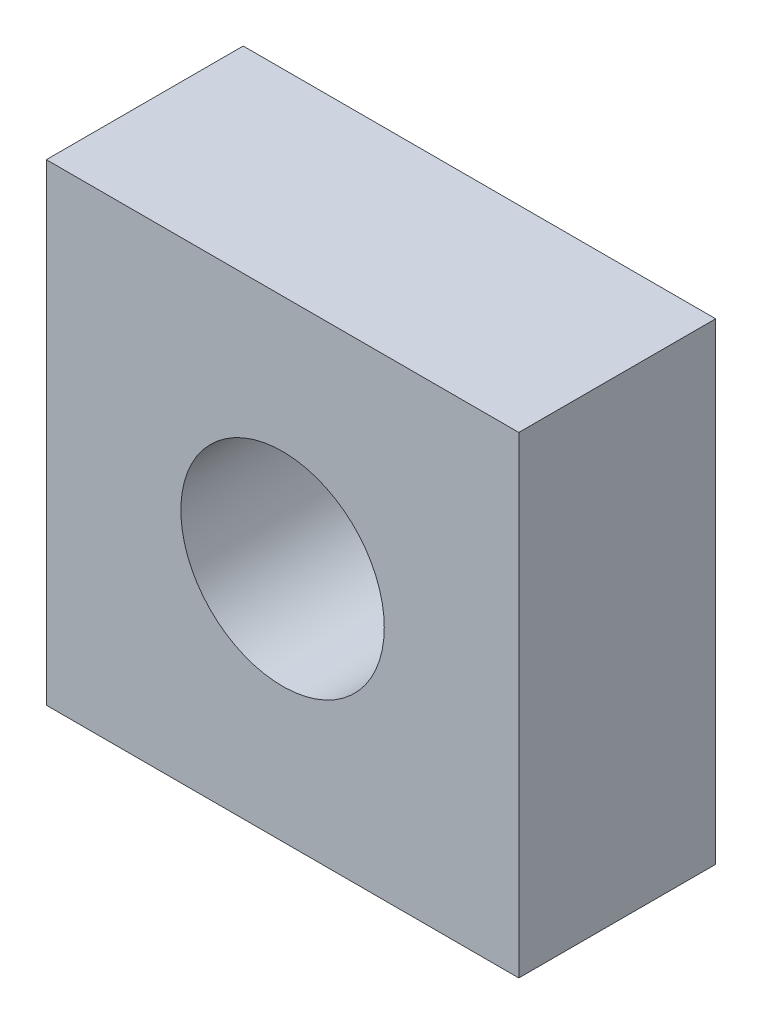
ISO-10303-21;
HEADER;
FILE_DESCRIPTION(('STEP AP214'),'2;1');
FILE_NAME('part.step','',(''),(''),'','','');
FILE_SCHEMA(('AUTOMOTIVE_DESIGN { 1 0 10303 214 1 1 1 1 }'));
ENDSEC;
DATA;
#1=APPLICATION_CONTEXT('core data for automotive mechanical design processes');
#2=APPLICATION_PROTOCOL_DEFINITION('international standard','automotive_design',2000,#1);
#3=PRODUCT_CONTEXT('',#1,'mechanical');
#4=PRODUCT('Part','Part','',(#3));
#5=PRODUCT_RELATED_PRODUCT_CATEGORY('part','',(#4));
#6=PRODUCT_DEFINITION_FORMATION('','',#4);
#7=PRODUCT_DEFINITION_CONTEXT('part definition',#1,'design');
#8=PRODUCT_DEFINITION('design','',#6,#7);
#9=PRODUCT_DEFINITION_SHAPE('','',#8);
#10=(LENGTH_UNIT() NAMED_UNIT(*) SI_UNIT(.MILLI.,.METRE.));
#11=(NAMED_UNIT(*) PLANE_ANGLE_UNIT() SI_UNIT($,.RADIAN.));
#12=(NAMED_UNIT(*) SI_UNIT($,.STERADIAN.) SOLID_ANGLE_UNIT());
#13=UNCERTAINTY_MEASURE_WITH_UNIT(LENGTH_MEASURE(1.E-05),#10,'distance_accuracy_value','');
#14=(GEOMETRIC_REPRESENTATION_CONTEXT(3) GLOBAL_UNCERTAINTY_ASSIGNED_CONTEXT((#13)) GLOBAL_UNIT_ASSIGNED_CONTEXT((#10,
#11,#12)) REPRESENTATION_CONTEXT('',''));
#15=CARTESIAN_POINT('',(0.,0.,0.));
#16=DIRECTION('',(0.,0.,1.));
#17=DIRECTION('',(1.,0.,0.));
#18=AXIS2_PLACEMENT_3D('',#15,#16,#17);
#19=CARTESIAN_POINT('',(-3.6,3.6,3.));
#20=DIRECTION('',(1.,0.,0.));
#21=DIRECTION('',(0.,1.,0.));
#22=AXIS2_PLACEMENT_3D('',#19,#20,#21);
#23=PLANE('',#22);
#24=DIRECTION('',(0.,-1.,0.));
#25=VECTOR('',#24,1.);
#26=CARTESIAN_POINT('',(-3.6,3.6,0.));
#27=LINE('',#26,#25);
#28=CARTESIAN_POINT('',(-3.6,3.6,0.));
#29=VERTEX_POINT('',#28);
#30=CARTESIAN_POINT('',(-3.6,-3.6,0.));
#31=VERTEX_POINT('',#30);
#32=EDGE_CURVE('E96',#29,#31,#27,.T.);
#33=ORIENTED_EDGE('',*,*,#32,.T.);
#34=DIRECTION('',(0.,0.,-1.));
#35=VECTOR('',#34,1.);
#36=CARTESIAN_POINT('',(-3.6,-3.6,3.));
#37=LINE('',#36,#35);
#38=CARTESIAN_POINT('',(-3.6,-3.6,3.));
#39=VERTEX_POINT('',#38);
#40=EDGE_CURVE('E11',#39,#31,#37,.T.);
#41=ORIENTED_EDGE('',*,*,#40,.F.);
#42=DIRECTION('',(0.,-1.,0.));
#43=VECTOR('',#42,1.);
#44=CARTESIAN_POINT('',(-3.6,3.6,3.));
#45=LINE('',#44,#43);
#46=CARTESIAN_POINT('',(-3.6,3.6,3.));
#47=VERTEX_POINT('',#46);
#48=EDGE_CURVE('E84',#47,#39,#45,.T.);
#49=ORIENTED_EDGE('',*,*,#48,.F.);
#50=DIRECTION('',(0.,0.,-1.));
#51=VECTOR('',#50,1.);
#52=CARTESIAN_POINT('',(-3.6,3.6,3.));
#53=LINE('',#52,#51);
#54=EDGE_CURVE('E92',#47,#29,#53,.T.);
#55=ORIENTED_EDGE('',*,*,#54,.T.);
#56=EDGE_LOOP('',(#33,#41,#49,#55));
#57=FACE_BOUND('',#56,.T.);
#58=ADVANCED_FACE('F33',(#57),#23,.F.);
#59=CARTESIAN_POINT('',(-3.6,-3.6,3.));
#60=DIRECTION('',(0.,1.,0.));
#61=DIRECTION('',(-1.,0.,0.));
#62=AXIS2_PLACEMENT_3D('',#59,#60,#61);
#63=PLANE('',#62);
#64=DIRECTION('',(1.,0.,0.));
#65=VECTOR('',#64,1.);
#66=CARTESIAN_POINT('',(-3.6,-3.6,0.));
#67=LINE('',#66,#65);
#68=CARTESIAN_POINT('',(3.6,-3.6,0.));
#69=VERTEX_POINT('',#68);
#70=EDGE_CURVE('E88',#31,#69,#67,.T.);
#71=ORIENTED_EDGE('',*,*,#70,.T.);
#72=DIRECTION('',(0.,0.,-1.));
#73=VECTOR('',#72,1.);
#74=CARTESIAN_POINT('',(3.6,-3.6,3.));
#75=LINE('',#74,#73);
#76=CARTESIAN_POINT('',(3.6,-3.6,3.));
#77=VERTEX_POINT('',#76);
#78=EDGE_CURVE('E41',#77,#69,#75,.T.);
#79=ORIENTED_EDGE('',*,*,#78,.F.);
#80=DIRECTION('',(1.,0.,0.));
#81=VECTOR('',#80,1.);
#82=CARTESIAN_POINT('',(-3.6,-3.6,3.));
#83=LINE('',#82,#81);
#84=EDGE_CURVE('E79',#39,#77,#83,.T.);
#85=ORIENTED_EDGE('',*,*,#84,.F.);
#86=ORIENTED_EDGE('',*,*,#40,.T.);
#87=EDGE_LOOP('',(#71,#79,#85,#86));
#88=FACE_BOUND('',#87,.T.);
#89=ADVANCED_FACE('F87',(#88),#63,.F.);
#90=CARTESIAN_POINT('',(3.6,3.6,3.));
#91=DIRECTION('',(-1.,0.,0.));
#92=DIRECTION('',(0.,-1.,0.));
#93=AXIS2_PLACEMENT_3D('',#90,#91,#92);
#94=PLANE('',#93);
#95=DIRECTION('',(0.,1.,0.));
#96=VECTOR('',#95,1.);
#97=CARTESIAN_POINT('',(3.6,3.6,0.));
#98=LINE('',#97,#96);
#99=CARTESIAN_POINT('',(3.6,3.6,0.));
#100=VERTEX_POINT('',#99);
#101=EDGE_CURVE('E66',#69,#100,#98,.T.);
#102=ORIENTED_EDGE('',*,*,#101,.T.);
#103=DIRECTION('',(0.,0.,-1.));
#104=VECTOR('',#103,1.);
#105=CARTESIAN_POINT('',(3.6,3.6,3.));
#106=LINE('',#105,#104);
#107=CARTESIAN_POINT('',(3.6,3.6,3.));
#108=VERTEX_POINT('',#107);
#109=EDGE_CURVE('E89',#108,#100,#106,.T.);
#110=ORIENTED_EDGE('',*,*,#109,.F.);
#111=DIRECTION('',(0.,1.,0.));
#112=VECTOR('',#111,1.);
#113=CARTESIAN_POINT('',(3.6,3.6,3.));
#114=LINE('',#113,#112);
#115=EDGE_CURVE('E82',#77,#108,#114,.T.);
#116=ORIENTED_EDGE('',*,*,#115,.F.);
#117=ORIENTED_EDGE('',*,*,#78,.T.);
#118=EDGE_LOOP('',(#102,#110,#116,#117));
#119=FACE_BOUND('',#118,.T.);
#120=ADVANCED_FACE('F90',(#119),#94,.F.);
#121=CARTESIAN_POINT('',(-3.6,3.6,3.));
#122=DIRECTION('',(0.,-1.,0.));
#123=DIRECTION('',(0.,0.,-1.));
#124=AXIS2_PLACEMENT_3D('',#121,#122,#123);
#125=PLANE('',#124);
#126=DIRECTION('',(-1.,0.,0.));
#127=VECTOR('',#126,1.);
#128=CARTESIAN_POINT('',(-3.6,3.6,0.));
#129=LINE('',#128,#127);
#130=EDGE_CURVE('E72',#100,#29,#129,.T.);
#131=ORIENTED_EDGE('',*,*,#130,.T.);
#132=ORIENTED_EDGE('',*,*,#54,.F.);
#133=DIRECTION('',(-1.,0.,0.));
#134=VECTOR('',#133,1.);
#135=CARTESIAN_POINT('',(-3.6,3.6,3.));
#136=LINE('',#135,#134);
#137=EDGE_CURVE('E49',#108,#47,#136,.T.);
#138=ORIENTED_EDGE('',*,*,#137,.F.);
#139=ORIENTED_EDGE('',*,*,#109,.T.);
#140=EDGE_LOOP('',(#131,#132,#138,#139));
#141=FACE_BOUND('',#140,.T.);
#142=ADVANCED_FACE('F104',(#141),#125,.F.);
#143=CARTESIAN_POINT('',(0.,0.,3.));
#144=DIRECTION('',(0.,0.,1.));
#145=DIRECTION('',(1.,0.,0.));
#146=AXIS2_PLACEMENT_3D('',#143,#144,#145);
#147=PLANE('',#146);
#148=CARTESIAN_POINT('',(0.,0.,3.));
#149=DIRECTION('',(0.,0.,1.));
#150=DIRECTION('',(1.,0.,0.));
#151=AXIS2_PLACEMENT_3D('',#148,#149,#150);
#152=CIRCLE('',#151,1.55);
#153=CARTESIAN_POINT('',(1.55,0.,3.));
#154=VERTEX_POINT('',#153);
#155=EDGE_CURVE('E110',#154,#154,#152,.T.);
#156=ORIENTED_EDGE('',*,*,#155,.F.);
#157=EDGE_LOOP('',(#156));
#158=FACE_BOUND('',#157,.T.);
#159=ORIENTED_EDGE('',*,*,#48,.T.);
#160=ORIENTED_EDGE('',*,*,#84,.T.);
#161=ORIENTED_EDGE('',*,*,#115,.T.);
#162=ORIENTED_EDGE('',*,*,#137,.T.);
#163=EDGE_LOOP('',(#159,#160,#161,#162));
#164=FACE_BOUND('',#163,.T.);
#165=ADVANCED_FACE('F80',(#158,#164),#147,.T.);
#166=CARTESIAN_POINT('',(0.,0.,0.));
#167=DIRECTION('',(0.,0.,1.));
#168=DIRECTION('',(1.,0.,0.));
#169=AXIS2_PLACEMENT_3D('',#166,#167,#168);
#170=PLANE('',#169);
#171=CARTESIAN_POINT('',(0.,0.,0.));
#172=DIRECTION('',(0.,0.,1.));
#173=DIRECTION('',(1.,0.,0.));
#174=AXIS2_PLACEMENT_3D('',#171,#172,#173);
#175=CIRCLE('',#174,1.55);
#176=CARTESIAN_POINT('',(1.55,0.,0.));
#177=VERTEX_POINT('',#176);
#178=EDGE_CURVE('E99',#177,#177,#175,.T.);
#179=ORIENTED_EDGE('',*,*,#178,.T.);
#180=EDGE_LOOP('',(#179));
#181=FACE_BOUND('',#180,.T.);
#182=ORIENTED_EDGE('',*,*,#32,.F.);
#183=ORIENTED_EDGE('',*,*,#130,.F.);
#184=ORIENTED_EDGE('',*,*,#101,.F.);
#185=ORIENTED_EDGE('',*,*,#70,.F.);
#186=EDGE_LOOP('',(#182,#183,#184,#185));
#187=FACE_BOUND('',#186,.T.);
#188=ADVANCED_FACE('F107',(#181,#187),#170,.F.);
#189=CARTESIAN_POINT('',(0.,0.,0.));
#190=DIRECTION('',(0.,0.,1.));
#191=DIRECTION('',(1.,0.,0.));
#192=AXIS2_PLACEMENT_3D('',#189,#190,#191);
#193=CYLINDRICAL_SURFACE('',#192,1.55);
#194=ORIENTED_EDGE('',*,*,#178,.F.);
#195=EDGE_LOOP('',(#194));
#196=FACE_BOUND('',#195,.T.);
#197=ORIENTED_EDGE('',*,*,#155,.T.);
#198=EDGE_LOOP('',(#197));
#199=FACE_BOUND('',#198,.T.);
#200=ADVANCED_FACE('F117',(#196,#199),#193,.F.);
#201=CLOSED_SHELL('',(#58,#89,#120,#142,#165,#188,#200));
#202=MANIFOLD_SOLID_BREP('B2',#201);
#203=ADVANCED_BREP_SHAPE_REPRESENTATION('',(#18,#202),#14);
#204=SHAPE_DEFINITION_REPRESENTATION(#9,#203);
ENDSEC;
END-ISO-10303-21;
